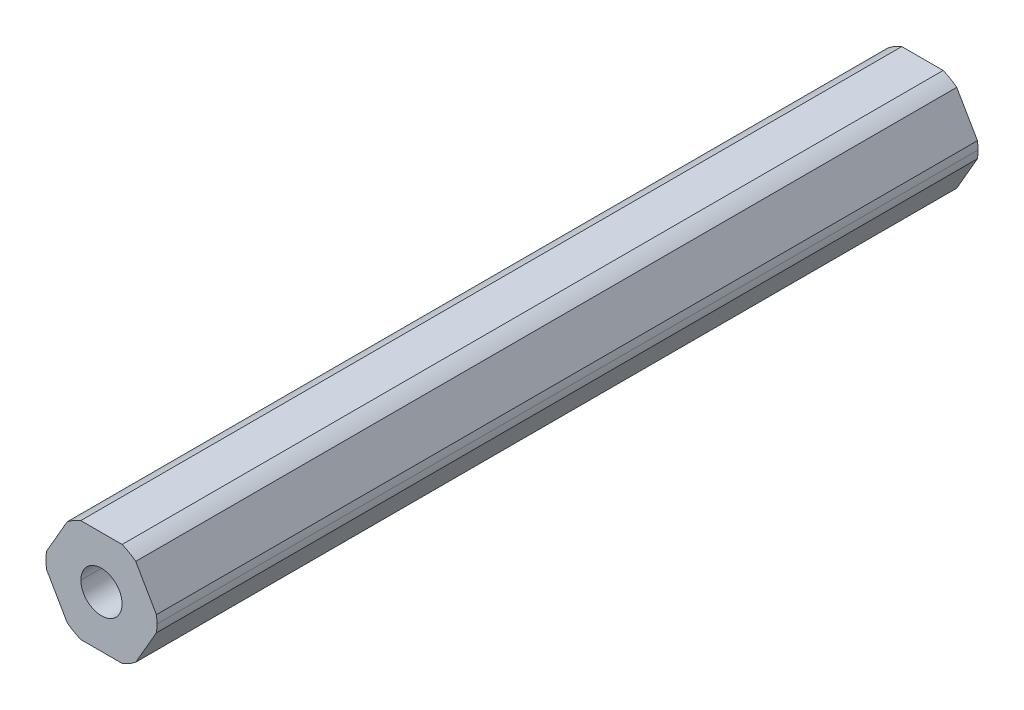
ISO-10303-21;
HEADER;
FILE_DESCRIPTION(('STEP AP214'),'2;1');
FILE_NAME('part.step','',(''),(''),'','','');
FILE_SCHEMA(('AUTOMOTIVE_DESIGN { 1 0 10303 214 1 1 1 1 }'));
ENDSEC;
DATA;
#1=APPLICATION_CONTEXT('core data for automotive mechanical design processes');
#2=APPLICATION_PROTOCOL_DEFINITION('international standard','automotive_design',2000,#1);
#3=PRODUCT_CONTEXT('',#1,'mechanical');
#4=PRODUCT('Part','Part','',(#3));
#5=PRODUCT_RELATED_PRODUCT_CATEGORY('part','',(#4));
#6=PRODUCT_DEFINITION_FORMATION('','',#4);
#7=PRODUCT_DEFINITION_CONTEXT('part definition',#1,'design');
#8=PRODUCT_DEFINITION('design','',#6,#7);
#9=PRODUCT_DEFINITION_SHAPE('','',#8);
#10=(LENGTH_UNIT() NAMED_UNIT(*) SI_UNIT(.MILLI.,.METRE.));
#11=(NAMED_UNIT(*) PLANE_ANGLE_UNIT() SI_UNIT($,.RADIAN.));
#12=(NAMED_UNIT(*) SI_UNIT($,.STERADIAN.) SOLID_ANGLE_UNIT());
#13=UNCERTAINTY_MEASURE_WITH_UNIT(LENGTH_MEASURE(1.E-05),#10,'distance_accuracy_value','');
#14=(GEOMETRIC_REPRESENTATION_CONTEXT(3) GLOBAL_UNCERTAINTY_ASSIGNED_CONTEXT((#13)) GLOBAL_UNIT_ASSIGNED_CONTEXT((#10,
#11,#12)) REPRESENTATION_CONTEXT('',''));
#15=CARTESIAN_POINT('',(0.,0.,0.));
#16=DIRECTION('',(0.,0.,1.));
#17=DIRECTION('',(1.,0.,0.));
#18=AXIS2_PLACEMENT_3D('',#15,#16,#17);
#19=CARTESIAN_POINT('',(0.,0.,-457.2));
#20=DIRECTION('',(0.,0.,1.));
#21=DIRECTION('',(1.,0.,0.));
#22=AXIS2_PLACEMENT_3D('',#19,#20,#21);
#23=CYLINDRICAL_SURFACE('',#22,2.55);
#24=DIRECTION('',(0.,0.,1.));
#25=VECTOR('',#24,1.);
#26=CARTESIAN_POINT('',(-2.55,0.,-457.2));
#27=LINE('',#26,#25);
#28=CARTESIAN_POINT('',(-2.55,0.,-296.926));
#29=VERTEX_POINT('',#28);
#30=CARTESIAN_POINT('',(-2.55,0.,-195.326));
#31=VERTEX_POINT('',#30);
#32=EDGE_CURVE('E200',#29,#31,#27,.T.);
#33=ORIENTED_EDGE('',*,*,#32,.F.);
#34=CARTESIAN_POINT('',(0.,0.,-296.926));
#35=DIRECTION('',(0.,0.,1.));
#36=DIRECTION('',(1.,0.,0.));
#37=AXIS2_PLACEMENT_3D('',#34,#35,#36);
#38=CIRCLE('',#37,2.55);
#39=CARTESIAN_POINT('',(2.55,0.,-296.926));
#40=VERTEX_POINT('',#39);
#41=EDGE_CURVE('E70',#29,#40,#38,.F.);
#42=ORIENTED_EDGE('',*,*,#41,.T.);
#43=DIRECTION('',(0.,0.,1.));
#44=VECTOR('',#43,1.);
#45=CARTESIAN_POINT('',(2.55,0.,-457.2));
#46=LINE('',#45,#44);
#47=CARTESIAN_POINT('',(2.55,0.,-195.326));
#48=VERTEX_POINT('',#47);
#49=EDGE_CURVE('E198',#40,#48,#46,.T.);
#50=ORIENTED_EDGE('',*,*,#49,.T.);
#51=CARTESIAN_POINT('',(0.,0.,-195.326));
#52=DIRECTION('',(0.,0.,-1.));
#53=DIRECTION('',(-1.,0.,0.));
#54=AXIS2_PLACEMENT_3D('',#51,#52,#53);
#55=CIRCLE('',#54,2.55);
#56=EDGE_CURVE('E205',#48,#31,#55,.F.);
#57=ORIENTED_EDGE('',*,*,#56,.T.);
#58=EDGE_LOOP('',(#33,#42,#50,#57));
#59=FACE_BOUND('',#58,.T.);
#60=ADVANCED_FACE('F48',(#59),#23,.F.);
#61=CARTESIAN_POINT('',(0.,0.,-457.2));
#62=DIRECTION('',(0.,0.,1.));
#63=DIRECTION('',(1.,0.,0.));
#64=AXIS2_PLACEMENT_3D('',#61,#62,#63);
#65=CYLINDRICAL_SURFACE('',#64,6.87);
#66=CARTESIAN_POINT('',(0.,0.,-296.926));
#67=DIRECTION('',(0.,0.,1.));
#68=DIRECTION('',(1.,0.,0.));
#69=AXIS2_PLACEMENT_3D('',#66,#67,#68);
#70=CIRCLE('',#69,6.87);
#71=CARTESIAN_POINT('',(2.55952629210952,6.37540000000001,-296.926));
#72=VERTEX_POINT('',#71);
#73=CARTESIAN_POINT('',(4.24149521323254,5.40431479062105,-296.926));
#74=VERTEX_POINT('',#73);
#75=EDGE_CURVE('E277',#72,#74,#70,.F.);
#76=ORIENTED_EDGE('',*,*,#75,.F.);
#77=DIRECTION('',(0.,0.,1.));
#78=VECTOR('',#77,1.);
#79=CARTESIAN_POINT('',(2.55952629210952,6.3754,-457.2));
#80=LINE('',#79,#78);
#81=CARTESIAN_POINT('',(2.55952629210952,6.3754,-195.326));
#82=VERTEX_POINT('',#81);
#83=EDGE_CURVE('E188',#72,#82,#80,.T.);
#84=ORIENTED_EDGE('',*,*,#83,.T.);
#85=CARTESIAN_POINT('',(0.,0.,-195.326));
#86=DIRECTION('',(0.,0.,-1.));
#87=DIRECTION('',(-1.,0.,0.));
#88=AXIS2_PLACEMENT_3D('',#85,#86,#87);
#89=CIRCLE('',#88,6.87);
#90=CARTESIAN_POINT('',(4.24149521323254,5.40431479062105,-195.326));
#91=VERTEX_POINT('',#90);
#92=EDGE_CURVE('E226',#91,#82,#89,.F.);
#93=ORIENTED_EDGE('',*,*,#92,.F.);
#94=DIRECTION('',(0.,0.,-1.));
#95=VECTOR('',#94,1.);
#96=CARTESIAN_POINT('',(4.24149521323254,5.40431479062105,-457.2));
#97=LINE('',#96,#95);
#98=EDGE_CURVE('E190',#91,#74,#97,.T.);
#99=ORIENTED_EDGE('',*,*,#98,.T.);
#100=EDGE_LOOP('',(#76,#84,#93,#99));
#101=FACE_BOUND('',#100,.T.);
#102=ADVANCED_FACE('F308',(#101),#65,.T.);
#103=CARTESIAN_POINT('',(0.,0.,-457.2));
#104=DIRECTION('',(0.,0.,1.));
#105=DIRECTION('',(1.,0.,0.));
#106=AXIS2_PLACEMENT_3D('',#103,#104,#105);
#107=CYLINDRICAL_SURFACE('',#106,6.87);
#108=CARTESIAN_POINT('',(0.,0.,-296.926));
#109=DIRECTION('',(0.,0.,1.));
#110=DIRECTION('',(1.,0.,0.));
#111=AXIS2_PLACEMENT_3D('',#108,#109,#110);
#112=CIRCLE('',#111,6.87);
#113=CARTESIAN_POINT('',(-4.24149521323254,5.40431479062105,-296.926));
#114=VERTEX_POINT('',#113);
#115=CARTESIAN_POINT('',(-2.55952629210953,6.3754,-296.926));
#116=VERTEX_POINT('',#115);
#117=EDGE_CURVE('E272',#114,#116,#112,.F.);
#118=ORIENTED_EDGE('',*,*,#117,.F.);
#119=DIRECTION('',(0.,0.,1.));
#120=VECTOR('',#119,1.);
#121=CARTESIAN_POINT('',(-4.24149521323255,5.40431479062105,-457.2));
#122=LINE('',#121,#120);
#123=CARTESIAN_POINT('',(-4.24149521323254,5.40431479062105,-195.326));
#124=VERTEX_POINT('',#123);
#125=EDGE_CURVE('E187',#114,#124,#122,.T.);
#126=ORIENTED_EDGE('',*,*,#125,.T.);
#127=CARTESIAN_POINT('',(0.,0.,-195.326));
#128=DIRECTION('',(0.,0.,-1.));
#129=DIRECTION('',(-1.,0.,0.));
#130=AXIS2_PLACEMENT_3D('',#127,#128,#129);
#131=CIRCLE('',#130,6.87);
#132=CARTESIAN_POINT('',(-2.55952629210953,6.3754,-195.326));
#133=VERTEX_POINT('',#132);
#134=EDGE_CURVE('E235',#133,#124,#131,.F.);
#135=ORIENTED_EDGE('',*,*,#134,.F.);
#136=DIRECTION('',(0.,0.,-1.));
#137=VECTOR('',#136,1.);
#138=CARTESIAN_POINT('',(-2.55952629210953,6.3754,-457.2));
#139=LINE('',#138,#137);
#140=EDGE_CURVE('E185',#133,#116,#139,.T.);
#141=ORIENTED_EDGE('',*,*,#140,.T.);
#142=EDGE_LOOP('',(#118,#126,#135,#141));
#143=FACE_BOUND('',#142,.T.);
#144=ADVANCED_FACE('F316',(#143),#107,.T.);
#145=CARTESIAN_POINT('',(0.,0.,-457.2));
#146=DIRECTION('',(0.,0.,1.));
#147=DIRECTION('',(1.,0.,0.));
#148=AXIS2_PLACEMENT_3D('',#145,#146,#147);
#149=CYLINDRICAL_SURFACE('',#148,6.87);
#150=CARTESIAN_POINT('',(0.,0.,-296.926));
#151=DIRECTION('',(0.,0.,1.));
#152=DIRECTION('',(1.,0.,0.));
#153=AXIS2_PLACEMENT_3D('',#150,#151,#152);
#154=CIRCLE('',#153,6.87);
#155=CARTESIAN_POINT('',(-6.80102150534208,-0.971085209378959,-296.926));
#156=VERTEX_POINT('',#155);
#157=CARTESIAN_POINT('',(-6.80102150534207,0.971085209378959,-296.926));
#158=VERTEX_POINT('',#157);
#159=EDGE_CURVE('E262',#156,#158,#154,.F.);
#160=ORIENTED_EDGE('',*,*,#159,.F.);
#161=DIRECTION('',(0.,0.,1.));
#162=VECTOR('',#161,1.);
#163=CARTESIAN_POINT('',(-6.80102150534208,-0.971085209378962,-457.2));
#164=LINE('',#163,#162);
#165=CARTESIAN_POINT('',(-6.80102150534208,-0.971085209378959,-195.326));
#166=VERTEX_POINT('',#165);
#167=EDGE_CURVE('E180',#156,#166,#164,.T.);
#168=ORIENTED_EDGE('',*,*,#167,.T.);
#169=CARTESIAN_POINT('',(0.,0.,-195.326));
#170=DIRECTION('',(0.,0.,-1.));
#171=DIRECTION('',(-1.,0.,0.));
#172=AXIS2_PLACEMENT_3D('',#169,#170,#171);
#173=CIRCLE('',#172,6.87);
#174=CARTESIAN_POINT('',(-6.80102150534207,0.971085209378959,-195.326));
#175=VERTEX_POINT('',#174);
#176=EDGE_CURVE('E232',#175,#166,#173,.F.);
#177=ORIENTED_EDGE('',*,*,#176,.F.);
#178=DIRECTION('',(0.,0.,-1.));
#179=VECTOR('',#178,1.);
#180=CARTESIAN_POINT('',(-6.80102150534208,0.97108520937896,-457.2));
#181=LINE('',#180,#179);
#182=EDGE_CURVE('E244',#175,#158,#181,.T.);
#183=ORIENTED_EDGE('',*,*,#182,.T.);
#184=EDGE_LOOP('',(#160,#168,#177,#183));
#185=FACE_BOUND('',#184,.T.);
#186=ADVANCED_FACE('F260',(#185),#149,.T.);
#187=CARTESIAN_POINT('',(0.,0.,-457.2));
#188=DIRECTION('',(0.,0.,1.));
#189=DIRECTION('',(1.,0.,0.));
#190=AXIS2_PLACEMENT_3D('',#187,#188,#189);
#191=CYLINDRICAL_SURFACE('',#190,6.87);
#192=CARTESIAN_POINT('',(0.,0.,-296.926));
#193=DIRECTION('',(0.,0.,1.));
#194=DIRECTION('',(1.,0.,0.));
#195=AXIS2_PLACEMENT_3D('',#192,#193,#194);
#196=CIRCLE('',#195,6.87);
#197=CARTESIAN_POINT('',(-2.55952629210953,-6.3754,-296.926));
#198=VERTEX_POINT('',#197);
#199=CARTESIAN_POINT('',(-4.24149521323254,-5.40431479062105,-296.926));
#200=VERTEX_POINT('',#199);
#201=EDGE_CURVE('E155',#198,#200,#196,.F.);
#202=ORIENTED_EDGE('',*,*,#201,.F.);
#203=DIRECTION('',(0.,0.,1.));
#204=VECTOR('',#203,1.);
#205=CARTESIAN_POINT('',(-2.55952629210953,-6.3754,-457.2));
#206=LINE('',#205,#204);
#207=CARTESIAN_POINT('',(-2.55952629210953,-6.3754,-195.326));
#208=VERTEX_POINT('',#207);
#209=EDGE_CURVE('E167',#198,#208,#206,.T.);
#210=ORIENTED_EDGE('',*,*,#209,.T.);
#211=CARTESIAN_POINT('',(0.,0.,-195.326));
#212=DIRECTION('',(0.,0.,-1.));
#213=DIRECTION('',(-1.,0.,0.));
#214=AXIS2_PLACEMENT_3D('',#211,#212,#213);
#215=CIRCLE('',#214,6.87);
#216=CARTESIAN_POINT('',(-4.24149521323254,-5.40431479062105,-195.326));
#217=VERTEX_POINT('',#216);
#218=EDGE_CURVE('E241',#217,#208,#215,.F.);
#219=ORIENTED_EDGE('',*,*,#218,.F.);
#220=DIRECTION('',(0.,0.,-1.));
#221=VECTOR('',#220,1.);
#222=CARTESIAN_POINT('',(-4.24149521323255,-5.40431479062104,-457.2));
#223=LINE('',#222,#221);
#224=EDGE_CURVE('E170',#217,#200,#223,.T.);
#225=ORIENTED_EDGE('',*,*,#224,.T.);
#226=EDGE_LOOP('',(#202,#210,#219,#225));
#227=FACE_BOUND('',#226,.T.);
#228=ADVANCED_FACE('F50',(#227),#191,.T.);
#229=CARTESIAN_POINT('',(0.,0.,-457.2));
#230=DIRECTION('',(0.,0.,1.));
#231=DIRECTION('',(1.,0.,0.));
#232=AXIS2_PLACEMENT_3D('',#229,#230,#231);
#233=CYLINDRICAL_SURFACE('',#232,6.87);
#234=CARTESIAN_POINT('',(0.,0.,-296.926));
#235=DIRECTION('',(0.,0.,1.));
#236=DIRECTION('',(1.,0.,0.));
#237=AXIS2_PLACEMENT_3D('',#234,#235,#236);
#238=CIRCLE('',#237,6.87);
#239=CARTESIAN_POINT('',(4.24149521323254,-5.40431479062105,-296.926));
#240=VERTEX_POINT('',#239);
#241=CARTESIAN_POINT('',(2.55952629210953,-6.3754,-296.926));
#242=VERTEX_POINT('',#241);
#243=EDGE_CURVE('E158',#240,#242,#238,.F.);
#244=ORIENTED_EDGE('',*,*,#243,.F.);
#245=DIRECTION('',(0.,0.,1.));
#246=VECTOR('',#245,1.);
#247=CARTESIAN_POINT('',(4.24149521323255,-5.40431479062104,-457.2));
#248=LINE('',#247,#246);
#249=CARTESIAN_POINT('',(4.24149521323254,-5.40431479062105,-195.326));
#250=VERTEX_POINT('',#249);
#251=EDGE_CURVE('E252',#240,#250,#248,.T.);
#252=ORIENTED_EDGE('',*,*,#251,.T.);
#253=CARTESIAN_POINT('',(0.,0.,-195.326));
#254=DIRECTION('',(0.,0.,-1.));
#255=DIRECTION('',(-1.,0.,0.));
#256=AXIS2_PLACEMENT_3D('',#253,#254,#255);
#257=CIRCLE('',#256,6.87);
#258=CARTESIAN_POINT('',(2.55952629210953,-6.3754,-195.326));
#259=VERTEX_POINT('',#258);
#260=EDGE_CURVE('E220',#259,#250,#257,.F.);
#261=ORIENTED_EDGE('',*,*,#260,.F.);
#262=DIRECTION('',(0.,0.,-1.));
#263=VECTOR('',#262,1.);
#264=CARTESIAN_POINT('',(2.55952629210953,-6.3754,-457.2));
#265=LINE('',#264,#263);
#266=EDGE_CURVE('E177',#259,#242,#265,.T.);
#267=ORIENTED_EDGE('',*,*,#266,.T.);
#268=EDGE_LOOP('',(#244,#252,#261,#267));
#269=FACE_BOUND('',#268,.T.);
#270=ADVANCED_FACE('F341',(#269),#233,.T.);
#271=CARTESIAN_POINT('',(0.,0.,-457.2));
#272=DIRECTION('',(0.,0.,1.));
#273=DIRECTION('',(1.,0.,0.));
#274=AXIS2_PLACEMENT_3D('',#271,#272,#273);
#275=CYLINDRICAL_SURFACE('',#274,6.87);
#276=CARTESIAN_POINT('',(0.,0.,-296.926));
#277=DIRECTION('',(0.,0.,1.));
#278=DIRECTION('',(1.,0.,0.));
#279=AXIS2_PLACEMENT_3D('',#276,#277,#278);
#280=CIRCLE('',#279,6.87);
#281=CARTESIAN_POINT('',(6.80102150534208,0.971085209378949,-296.926));
#282=VERTEX_POINT('',#281);
#283=CARTESIAN_POINT('',(6.87,0.,-296.926));
#284=VERTEX_POINT('',#283);
#285=EDGE_CURVE('E63',#282,#284,#280,.F.);
#286=ORIENTED_EDGE('',*,*,#285,.F.);
#287=DIRECTION('',(0.,0.,1.));
#288=VECTOR('',#287,1.);
#289=CARTESIAN_POINT('',(6.80102150534208,0.971085209378949,-457.2));
#290=LINE('',#289,#288);
#291=CARTESIAN_POINT('',(6.80102150534208,0.971085209378949,-195.326));
#292=VERTEX_POINT('',#291);
#293=EDGE_CURVE('E192',#282,#292,#290,.T.);
#294=ORIENTED_EDGE('',*,*,#293,.T.);
#295=CARTESIAN_POINT('',(0.,0.,-195.326));
#296=DIRECTION('',(0.,0.,-1.));
#297=DIRECTION('',(-1.,0.,0.));
#298=AXIS2_PLACEMENT_3D('',#295,#296,#297);
#299=CIRCLE('',#298,6.87);
#300=CARTESIAN_POINT('',(6.87,0.,-195.326));
#301=VERTEX_POINT('',#300);
#302=EDGE_CURVE('E217',#301,#292,#299,.F.);
#303=ORIENTED_EDGE('',*,*,#302,.F.);
#304=DIRECTION('',(0.,0.,1.));
#305=VECTOR('',#304,1.);
#306=CARTESIAN_POINT('',(6.87,0.,-457.2));
#307=LINE('',#306,#305);
#308=EDGE_CURVE('E246',#284,#301,#307,.T.);
#309=ORIENTED_EDGE('',*,*,#308,.F.);
#310=EDGE_LOOP('',(#286,#294,#303,#309));
#311=FACE_BOUND('',#310,.T.);
#312=ADVANCED_FACE('F299',(#311),#275,.T.);
#313=CARTESIAN_POINT('',(-3.68083890619154,-6.3754,457.2));
#314=DIRECTION('',(0.,1.,0.));
#315=DIRECTION('',(1.,0.,0.));
#316=AXIS2_PLACEMENT_3D('',#313,#314,#315);
#317=PLANE('',#316);
#318=ORIENTED_EDGE('',*,*,#209,.F.);
#319=DIRECTION('',(1.,0.,0.));
#320=VECTOR('',#319,1.);
#321=CARTESIAN_POINT('',(-6.87,-6.3754,-296.926));
#322=LINE('',#321,#320);
#323=EDGE_CURVE('E152',#198,#242,#322,.T.);
#324=ORIENTED_EDGE('',*,*,#323,.T.);
#325=ORIENTED_EDGE('',*,*,#266,.F.);
#326=DIRECTION('',(1.,0.,0.));
#327=VECTOR('',#326,1.);
#328=CARTESIAN_POINT('',(-6.87,-6.3754,-195.326));
#329=LINE('',#328,#327);
#330=EDGE_CURVE('E176',#208,#259,#329,.T.);
#331=ORIENTED_EDGE('',*,*,#330,.F.);
#332=EDGE_LOOP('',(#318,#324,#325,#331));
#333=FACE_BOUND('',#332,.T.);
#334=ADVANCED_FACE('F175',(#333),#317,.F.);
#335=CARTESIAN_POINT('',(-7.36167781238308,0.,457.2));
#336=DIRECTION('',(0.866025403784439,0.5,0.));
#337=DIRECTION('',(0.,0.,-1.));
#338=AXIS2_PLACEMENT_3D('',#335,#336,#337);
#339=PLANE('',#338);
#340=ORIENTED_EDGE('',*,*,#167,.F.);
#341=DIRECTION('',(0.5,-0.866025403784439,0.));
#342=VECTOR('',#341,1.);
#343=CARTESIAN_POINT('',(-7.36167781238308,0.,-296.926));
#344=LINE('',#343,#342);
#345=EDGE_CURVE('E172',#156,#200,#344,.T.);
#346=ORIENTED_EDGE('',*,*,#345,.T.);
#347=ORIENTED_EDGE('',*,*,#224,.F.);
#348=DIRECTION('',(-0.5,0.866025403784439,0.));
#349=VECTOR('',#348,1.);
#350=CARTESIAN_POINT('',(-7.36167781238308,0.,-195.326));
#351=LINE('',#350,#349);
#352=EDGE_CURVE('E238',#217,#166,#351,.T.);
#353=ORIENTED_EDGE('',*,*,#352,.T.);
#354=EDGE_LOOP('',(#340,#346,#347,#353));
#355=FACE_BOUND('',#354,.T.);
#356=ADVANCED_FACE('F265',(#355),#339,.F.);
#357=CARTESIAN_POINT('',(-3.68083890619154,6.3754,457.2));
#358=DIRECTION('',(0.866025403784439,-0.5,0.));
#359=DIRECTION('',(0.,0.,-1.));
#360=AXIS2_PLACEMENT_3D('',#357,#358,#359);
#361=PLANE('',#360);
#362=ORIENTED_EDGE('',*,*,#125,.F.);
#363=DIRECTION('',(-0.5,-0.866025403784439,0.));
#364=VECTOR('',#363,1.);
#365=CARTESIAN_POINT('',(-3.68083890619154,6.3754,-296.926));
#366=LINE('',#365,#364);
#367=EDGE_CURVE('E267',#114,#158,#366,.T.);
#368=ORIENTED_EDGE('',*,*,#367,.T.);
#369=ORIENTED_EDGE('',*,*,#182,.F.);
#370=DIRECTION('',(0.5,0.866025403784439,0.));
#371=VECTOR('',#370,1.);
#372=CARTESIAN_POINT('',(-3.68083890619154,6.3754,-195.326));
#373=LINE('',#372,#371);
#374=EDGE_CURVE('E229',#175,#124,#373,.T.);
#375=ORIENTED_EDGE('',*,*,#374,.T.);
#376=EDGE_LOOP('',(#362,#368,#369,#375));
#377=FACE_BOUND('',#376,.T.);
#378=ADVANCED_FACE('F319',(#377),#361,.F.);
#379=CARTESIAN_POINT('',(3.68083890619154,6.3754,457.2));
#380=DIRECTION('',(0.,-1.,0.));
#381=DIRECTION('',(0.,0.,-1.));
#382=AXIS2_PLACEMENT_3D('',#379,#380,#381);
#383=PLANE('',#382);
#384=ORIENTED_EDGE('',*,*,#83,.F.);
#385=DIRECTION('',(-1.,0.,0.));
#386=VECTOR('',#385,1.);
#387=CARTESIAN_POINT('',(3.68083890619154,6.3754,-296.926));
#388=LINE('',#387,#386);
#389=EDGE_CURVE('E274',#72,#116,#388,.T.);
#390=ORIENTED_EDGE('',*,*,#389,.T.);
#391=ORIENTED_EDGE('',*,*,#140,.F.);
#392=DIRECTION('',(1.,0.,0.));
#393=VECTOR('',#392,1.);
#394=CARTESIAN_POINT('',(-6.87,6.3754,-195.326));
#395=LINE('',#394,#393);
#396=EDGE_CURVE('E171',#133,#82,#395,.T.);
#397=ORIENTED_EDGE('',*,*,#396,.T.);
#398=EDGE_LOOP('',(#384,#390,#391,#397));
#399=FACE_BOUND('',#398,.T.);
#400=ADVANCED_FACE('F311',(#399),#383,.F.);
#401=CARTESIAN_POINT('',(7.36167781238308,0.,457.2));
#402=DIRECTION('',(-0.866025403784439,-0.5,0.));
#403=DIRECTION('',(-0.5,0.866025403784439,0.));
#404=AXIS2_PLACEMENT_3D('',#401,#402,#403);
#405=PLANE('',#404);
#406=ORIENTED_EDGE('',*,*,#293,.F.);
#407=DIRECTION('',(-0.5,0.866025403784439,0.));
#408=VECTOR('',#407,1.);
#409=CARTESIAN_POINT('',(7.36167781238308,0.,-296.926));
#410=LINE('',#409,#408);
#411=EDGE_CURVE('E279',#282,#74,#410,.T.);
#412=ORIENTED_EDGE('',*,*,#411,.T.);
#413=ORIENTED_EDGE('',*,*,#98,.F.);
#414=DIRECTION('',(0.5,-0.866025403784439,0.));
#415=VECTOR('',#414,1.);
#416=CARTESIAN_POINT('',(7.36167781238308,0.,-195.326));
#417=LINE('',#416,#415);
#418=EDGE_CURVE('E223',#91,#292,#417,.T.);
#419=ORIENTED_EDGE('',*,*,#418,.T.);
#420=EDGE_LOOP('',(#406,#412,#413,#419));
#421=FACE_BOUND('',#420,.T.);
#422=ADVANCED_FACE('F302',(#421),#405,.F.);
#423=CARTESIAN_POINT('',(3.68083890619154,-6.3754,457.2));
#424=DIRECTION('',(-0.866025403784439,0.5,0.));
#425=DIRECTION('',(0.,0.,1.));
#426=AXIS2_PLACEMENT_3D('',#423,#424,#425);
#427=PLANE('',#426);
#428=ORIENTED_EDGE('',*,*,#251,.F.);
#429=DIRECTION('',(0.5,0.866025403784439,0.));
#430=VECTOR('',#429,1.);
#431=CARTESIAN_POINT('',(3.68083890619154,-6.3754,-296.926));
#432=LINE('',#431,#430);
#433=CARTESIAN_POINT('',(6.80102150534208,-0.97108520937896,-296.926));
#434=VERTEX_POINT('',#433);
#435=EDGE_CURVE('E284',#240,#434,#432,.T.);
#436=ORIENTED_EDGE('',*,*,#435,.T.);
#437=DIRECTION('',(0.,0.,-1.));
#438=VECTOR('',#437,1.);
#439=CARTESIAN_POINT('',(6.80102150534208,-0.971085209378962,-457.2));
#440=LINE('',#439,#438);
#441=CARTESIAN_POINT('',(6.80102150534208,-0.971085209378962,-195.326));
#442=VERTEX_POINT('',#441);
#443=EDGE_CURVE('E248',#442,#434,#440,.T.);
#444=ORIENTED_EDGE('',*,*,#443,.F.);
#445=DIRECTION('',(-0.5,-0.866025403784439,0.));
#446=VECTOR('',#445,1.);
#447=CARTESIAN_POINT('',(3.68083890619154,-6.3754,-195.326));
#448=LINE('',#447,#446);
#449=EDGE_CURVE('E210',#442,#250,#448,.T.);
#450=ORIENTED_EDGE('',*,*,#449,.T.);
#451=EDGE_LOOP('',(#428,#436,#444,#450));
#452=FACE_BOUND('',#451,.T.);
#453=ADVANCED_FACE('F294',(#452),#427,.F.);
#454=CARTESIAN_POINT('',(0.,0.,-457.2));
#455=DIRECTION('',(0.,0.,1.));
#456=DIRECTION('',(1.,0.,0.));
#457=AXIS2_PLACEMENT_3D('',#454,#455,#456);
#458=CYLINDRICAL_SURFACE('',#457,6.87);
#459=CARTESIAN_POINT('',(0.,0.,-296.926));
#460=DIRECTION('',(0.,0.,1.));
#461=DIRECTION('',(1.,0.,0.));
#462=AXIS2_PLACEMENT_3D('',#459,#460,#461);
#463=CIRCLE('',#462,6.87);
#464=EDGE_CURVE('E287',#284,#434,#463,.F.);
#465=ORIENTED_EDGE('',*,*,#464,.F.);
#466=ORIENTED_EDGE('',*,*,#308,.T.);
#467=CARTESIAN_POINT('',(0.,0.,-195.326));
#468=DIRECTION('',(0.,0.,-1.));
#469=DIRECTION('',(-1.,0.,0.));
#470=AXIS2_PLACEMENT_3D('',#467,#468,#469);
#471=CIRCLE('',#470,6.87);
#472=EDGE_CURVE('E207',#442,#301,#471,.F.);
#473=ORIENTED_EDGE('',*,*,#472,.F.);
#474=ORIENTED_EDGE('',*,*,#443,.T.);
#475=EDGE_LOOP('',(#465,#466,#473,#474));
#476=FACE_BOUND('',#475,.T.);
#477=ADVANCED_FACE('F296',(#476),#458,.T.);
#478=CARTESIAN_POINT('',(0.,0.,-457.2));
#479=DIRECTION('',(0.,0.,1.));
#480=DIRECTION('',(1.,0.,0.));
#481=AXIS2_PLACEMENT_3D('',#478,#479,#480);
#482=CYLINDRICAL_SURFACE('',#481,2.55);
#483=ORIENTED_EDGE('',*,*,#49,.F.);
#484=CARTESIAN_POINT('',(0.,0.,-296.926));
#485=DIRECTION('',(0.,0.,1.));
#486=DIRECTION('',(1.,0.,0.));
#487=AXIS2_PLACEMENT_3D('',#484,#485,#486);
#488=CIRCLE('',#487,2.55);
#489=EDGE_CURVE('E11',#40,#29,#488,.F.);
#490=ORIENTED_EDGE('',*,*,#489,.T.);
#491=ORIENTED_EDGE('',*,*,#32,.T.);
#492=CARTESIAN_POINT('',(0.,0.,-195.326));
#493=DIRECTION('',(0.,0.,-1.));
#494=DIRECTION('',(-1.,0.,0.));
#495=AXIS2_PLACEMENT_3D('',#492,#493,#494);
#496=CIRCLE('',#495,2.55);
#497=EDGE_CURVE('E56',#31,#48,#496,.F.);
#498=ORIENTED_EDGE('',*,*,#497,.T.);
#499=EDGE_LOOP('',(#483,#490,#491,#498));
#500=FACE_BOUND('',#499,.T.);
#501=ADVANCED_FACE('F197',(#500),#482,.F.);
#502=CARTESIAN_POINT('',(-6.87,6.3754,-195.326));
#503=DIRECTION('',(0.,0.,-1.));
#504=DIRECTION('',(-1.,0.,0.));
#505=AXIS2_PLACEMENT_3D('',#502,#503,#504);
#506=PLANE('',#505);
#507=ORIENTED_EDGE('',*,*,#218,.T.);
#508=ORIENTED_EDGE('',*,*,#330,.T.);
#509=ORIENTED_EDGE('',*,*,#260,.T.);
#510=ORIENTED_EDGE('',*,*,#449,.F.);
#511=ORIENTED_EDGE('',*,*,#472,.T.);
#512=ORIENTED_EDGE('',*,*,#302,.T.);
#513=ORIENTED_EDGE('',*,*,#418,.F.);
#514=ORIENTED_EDGE('',*,*,#92,.T.);
#515=ORIENTED_EDGE('',*,*,#396,.F.);
#516=ORIENTED_EDGE('',*,*,#134,.T.);
#517=ORIENTED_EDGE('',*,*,#374,.F.);
#518=ORIENTED_EDGE('',*,*,#176,.T.);
#519=ORIENTED_EDGE('',*,*,#352,.F.);
#520=EDGE_LOOP('',(#507,#508,#509,#510,#511,#512,#513,#514,#515,#516,#517,#518,#519));
#521=FACE_BOUND('',#520,.T.);
#522=ORIENTED_EDGE('',*,*,#497,.F.);
#523=ORIENTED_EDGE('',*,*,#56,.F.);
#524=EDGE_LOOP('',(#522,#523));
#525=FACE_BOUND('',#524,.T.);
#526=ADVANCED_FACE('F204',(#521,#525),#506,.F.);
#527=CARTESIAN_POINT('',(-6.87,25.4545831010605,-296.926));
#528=DIRECTION('',(0.,0.,1.));
#529=DIRECTION('',(1.,0.,0.));
#530=AXIS2_PLACEMENT_3D('',#527,#528,#529);
#531=PLANE('',#530);
#532=ORIENTED_EDGE('',*,*,#201,.T.);
#533=ORIENTED_EDGE('',*,*,#345,.F.);
#534=ORIENTED_EDGE('',*,*,#159,.T.);
#535=ORIENTED_EDGE('',*,*,#367,.F.);
#536=ORIENTED_EDGE('',*,*,#117,.T.);
#537=ORIENTED_EDGE('',*,*,#389,.F.);
#538=ORIENTED_EDGE('',*,*,#75,.T.);
#539=ORIENTED_EDGE('',*,*,#411,.F.);
#540=ORIENTED_EDGE('',*,*,#285,.T.);
#541=ORIENTED_EDGE('',*,*,#464,.T.);
#542=ORIENTED_EDGE('',*,*,#435,.F.);
#543=ORIENTED_EDGE('',*,*,#243,.T.);
#544=ORIENTED_EDGE('',*,*,#323,.F.);
#545=EDGE_LOOP('',(#532,#533,#534,#535,#536,#537,#538,#539,#540,#541,#542,#543,#544));
#546=FACE_BOUND('',#545,.T.);
#547=ORIENTED_EDGE('',*,*,#489,.F.);
#548=ORIENTED_EDGE('',*,*,#41,.F.);
#549=EDGE_LOOP('',(#547,#548));
#550=FACE_BOUND('',#549,.T.);
#551=ADVANCED_FACE('F154',(#546,#550),#531,.F.);
#552=CLOSED_SHELL('',(#60,#102,#144,#186,#228,#270,#312,#334,#356,#378,#400,#422,#453,#477,#501,
#526,#551));
#553=MANIFOLD_SOLID_BREP('B2',#552);
#554=ADVANCED_BREP_SHAPE_REPRESENTATION('',(#18,#553),#14);
#555=SHAPE_DEFINITION_REPRESENTATION(#9,#554);
ENDSEC;
END-ISO-10303-21;
